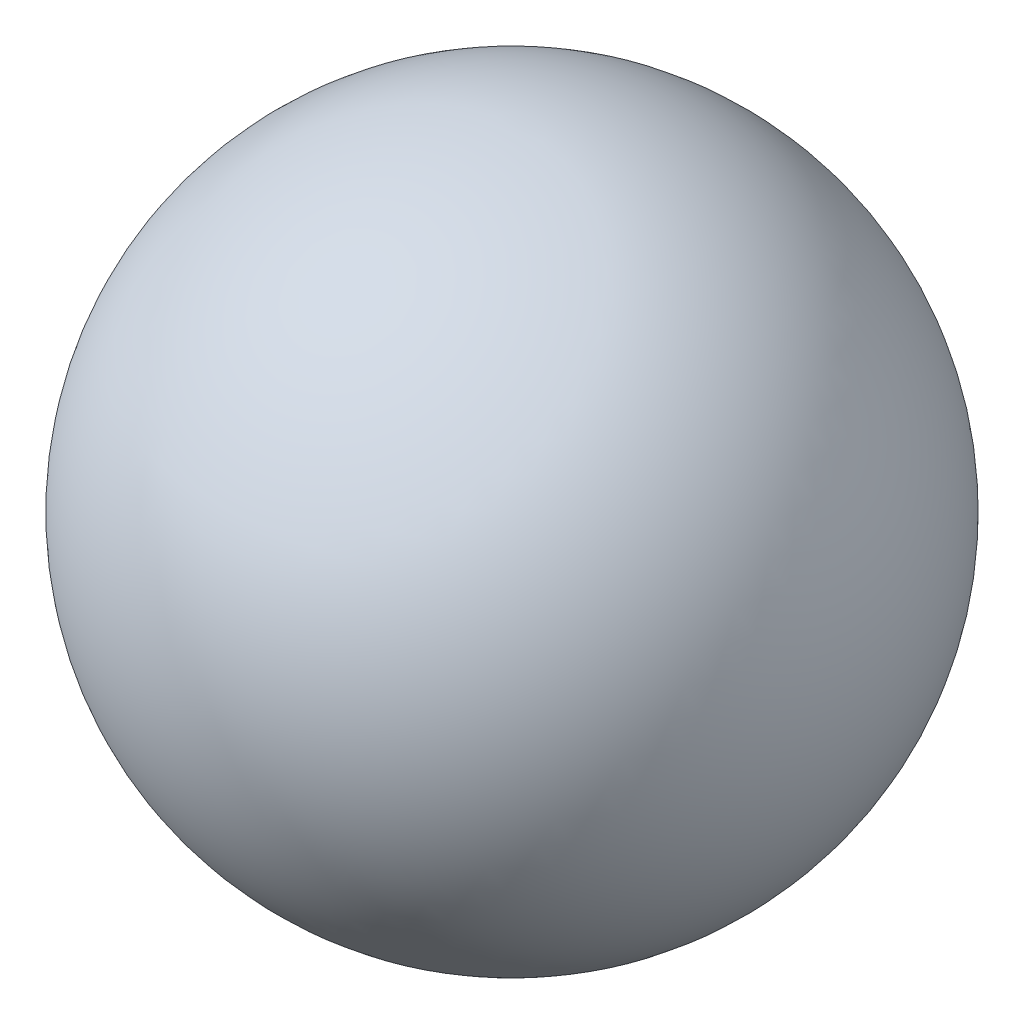
ISO-10303-21;
HEADER;
FILE_DESCRIPTION(('STEP AP214'),'2;1');
FILE_NAME('part.step','',(''),(''),'','','');
FILE_SCHEMA(('AUTOMOTIVE_DESIGN { 1 0 10303 214 1 1 1 1 }'));
ENDSEC;
DATA;
#1=APPLICATION_CONTEXT('core data for automotive mechanical design processes');
#2=APPLICATION_PROTOCOL_DEFINITION('international standard','automotive_design',2000,#1);
#3=PRODUCT_CONTEXT('',#1,'mechanical');
#4=PRODUCT('Part','Part','',(#3));
#5=PRODUCT_RELATED_PRODUCT_CATEGORY('part','',(#4));
#6=PRODUCT_DEFINITION_FORMATION('','',#4);
#7=PRODUCT_DEFINITION_CONTEXT('part definition',#1,'design');
#8=PRODUCT_DEFINITION('design','',#6,#7);
#9=PRODUCT_DEFINITION_SHAPE('','',#8);
#10=(LENGTH_UNIT() NAMED_UNIT(*) SI_UNIT(.MILLI.,.METRE.));
#11=(NAMED_UNIT(*) PLANE_ANGLE_UNIT() SI_UNIT($,.RADIAN.));
#12=(NAMED_UNIT(*) SI_UNIT($,.STERADIAN.) SOLID_ANGLE_UNIT());
#13=UNCERTAINTY_MEASURE_WITH_UNIT(LENGTH_MEASURE(1.E-05),#10,'distance_accuracy_value','');
#14=(GEOMETRIC_REPRESENTATION_CONTEXT(3) GLOBAL_UNCERTAINTY_ASSIGNED_CONTEXT((#13)) GLOBAL_UNIT_ASSIGNED_CONTEXT((#10,
#11,#12)) REPRESENTATION_CONTEXT('',''));
#15=CARTESIAN_POINT('',(0.,0.,0.));
#16=DIRECTION('',(0.,0.,1.));
#17=DIRECTION('',(1.,0.,0.));
#18=AXIS2_PLACEMENT_3D('',#15,#16,#17);
#19=CARTESIAN_POINT('',(0.,0.,0.));
#20=DIRECTION('',(0.,-1.,0.));
#21=DIRECTION('',(-1.,0.,0.));
#22=AXIS2_PLACEMENT_3D('',#19,#20,#21);
#23=SPHERICAL_SURFACE('',#22,75.);
#24=CARTESIAN_POINT('',(0.,-75.,0.));
#25=VERTEX_POINT('',#24);
#26=VERTEX_LOOP('',#25);
#27=FACE_BOUND('',#26,.T.);
#28=ADVANCED_FACE('F33',(#27),#23,.T.);
#29=CLOSED_SHELL('',(#28));
#30=MANIFOLD_SOLID_BREP('B2',#29);
#31=ADVANCED_BREP_SHAPE_REPRESENTATION('',(#18,#30),#14);
#32=SHAPE_DEFINITION_REPRESENTATION(#9,#31);
ENDSEC;
END-ISO-10303-21;
